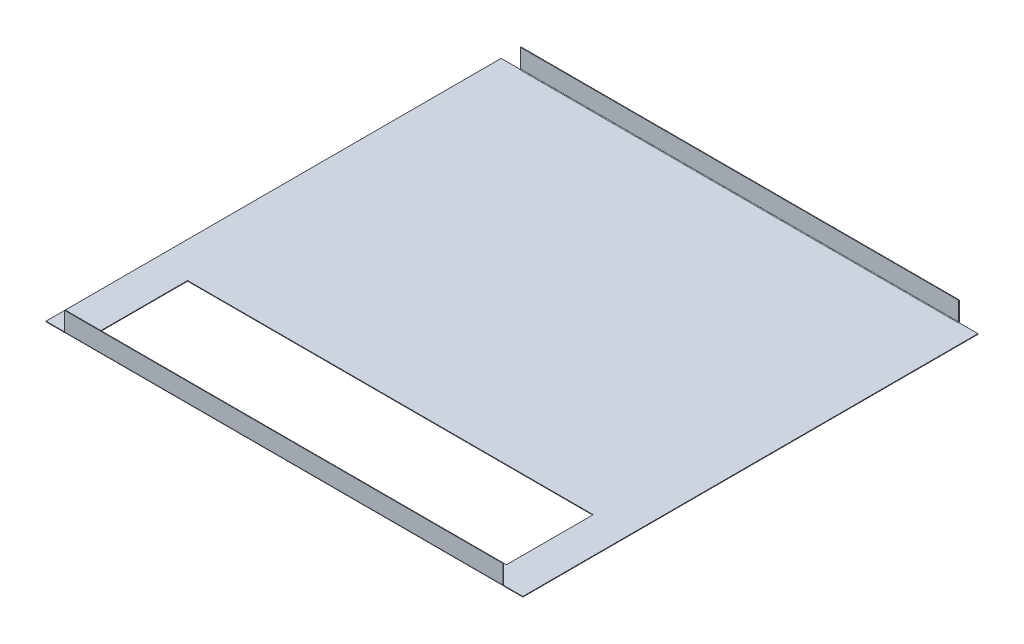
ISO-10303-21;
HEADER;
FILE_DESCRIPTION(('STEP AP214'),'2;1');
FILE_NAME('part.step','',(''),(''),'','','');
FILE_SCHEMA(('AUTOMOTIVE_DESIGN { 1 0 10303 214 1 1 1 1 }'));
ENDSEC;
DATA;
#1=APPLICATION_CONTEXT('core data for automotive mechanical design processes');
#2=APPLICATION_PROTOCOL_DEFINITION('international standard','automotive_design',2000,#1);
#3=PRODUCT_CONTEXT('',#1,'mechanical');
#4=PRODUCT('Part','Part','',(#3));
#5=PRODUCT_RELATED_PRODUCT_CATEGORY('part','',(#4));
#6=PRODUCT_DEFINITION_FORMATION('','',#4);
#7=PRODUCT_DEFINITION_CONTEXT('part definition',#1,'design');
#8=PRODUCT_DEFINITION('design','',#6,#7);
#9=PRODUCT_DEFINITION_SHAPE('','',#8);
#10=(LENGTH_UNIT() NAMED_UNIT(*) SI_UNIT(.MILLI.,.METRE.));
#11=(NAMED_UNIT(*) PLANE_ANGLE_UNIT() SI_UNIT($,.RADIAN.));
#12=(NAMED_UNIT(*) SI_UNIT($,.STERADIAN.) SOLID_ANGLE_UNIT());
#13=UNCERTAINTY_MEASURE_WITH_UNIT(LENGTH_MEASURE(1.E-05),#10,'distance_accuracy_value','');
#14=(GEOMETRIC_REPRESENTATION_CONTEXT(3) GLOBAL_UNCERTAINTY_ASSIGNED_CONTEXT((#13)) GLOBAL_UNIT_ASSIGNED_CONTEXT((#10,
#11,#12)) REPRESENTATION_CONTEXT('',''));
#15=CARTESIAN_POINT('',(0.,0.,0.));
#16=DIRECTION('',(0.,0.,1.));
#17=DIRECTION('',(1.,0.,0.));
#18=AXIS2_PLACEMENT_3D('',#15,#16,#17);
#19=CARTESIAN_POINT('',(-455.,0.,471.3));
#20=DIRECTION('',(1.,0.,0.));
#21=DIRECTION('',(0.,0.,-1.));
#22=AXIS2_PLACEMENT_3D('',#19,#20,#21);
#23=PLANE('',#22);
#24=DIRECTION('',(0.,0.,1.));
#25=VECTOR('',#24,1.);
#26=CARTESIAN_POINT('',(-455.000000000044,-1.2,-472.499999999956));
#27=LINE('',#26,#25);
#28=CARTESIAN_POINT('',(-455.,-1.2,471.3));
#29=VERTEX_POINT('',#28);
#30=CARTESIAN_POINT('',(-455.,-1.2,472.5));
#31=VERTEX_POINT('',#30);
#32=EDGE_CURVE('E275',#29,#31,#27,.T.);
#33=ORIENTED_EDGE('',*,*,#32,.F.);
#34=CARTESIAN_POINT('',(-455.,1.20000000000001,471.3));
#35=DIRECTION('',(1.,0.,0.));
#36=DIRECTION('',(0.,0.,-1.));
#37=AXIS2_PLACEMENT_3D('',#34,#35,#36);
#38=CIRCLE('',#37,2.40000000000003);
#39=CARTESIAN_POINT('',(-455.,-0.878460969082665,472.5));
#40=VERTEX_POINT('',#39);
#41=EDGE_CURVE('E52',#29,#40,#38,.F.);
#42=ORIENTED_EDGE('',*,*,#41,.T.);
#43=DIRECTION('',(0.,-1.,0.));
#44=VECTOR('',#43,1.);
#45=CARTESIAN_POINT('',(-455.,0.,472.5));
#46=LINE('',#45,#44);
#47=EDGE_CURVE('E279',#40,#31,#46,.T.);
#48=ORIENTED_EDGE('',*,*,#47,.T.);
#49=EDGE_LOOP('',(#33,#42,#48));
#50=FACE_BOUND('',#49,.T.);
#51=ADVANCED_FACE('F34',(#50),#23,.T.);
#52=CARTESIAN_POINT('',(455.,0.,472.5));
#53=DIRECTION('',(-1.,0.,0.));
#54=DIRECTION('',(0.,0.,1.));
#55=AXIS2_PLACEMENT_3D('',#52,#53,#54);
#56=PLANE('',#55);
#57=DIRECTION('',(0.,-1.,0.));
#58=VECTOR('',#57,1.);
#59=CARTESIAN_POINT('',(455.,0.,472.5));
#60=LINE('',#59,#58);
#61=CARTESIAN_POINT('',(455.,-0.878460969082665,472.5));
#62=VERTEX_POINT('',#61);
#63=CARTESIAN_POINT('',(455.,-1.2,472.5));
#64=VERTEX_POINT('',#63);
#65=EDGE_CURVE('E59',#62,#64,#60,.T.);
#66=ORIENTED_EDGE('',*,*,#65,.F.);
#67=CARTESIAN_POINT('',(455.,1.20000000000001,471.3));
#68=DIRECTION('',(1.,0.,0.));
#69=DIRECTION('',(0.,0.,-1.));
#70=AXIS2_PLACEMENT_3D('',#67,#68,#69);
#71=CIRCLE('',#70,2.40000000000003);
#72=CARTESIAN_POINT('',(455.,-1.2,471.3));
#73=VERTEX_POINT('',#72);
#74=EDGE_CURVE('E11',#62,#73,#71,.T.);
#75=ORIENTED_EDGE('',*,*,#74,.T.);
#76=DIRECTION('',(0.,0.,-1.));
#77=VECTOR('',#76,1.);
#78=CARTESIAN_POINT('',(455.000000000044,-1.2,-472.500000000002));
#79=LINE('',#78,#77);
#80=EDGE_CURVE('E286',#64,#73,#79,.T.);
#81=ORIENTED_EDGE('',*,*,#80,.F.);
#82=EDGE_LOOP('',(#66,#75,#81));
#83=FACE_BOUND('',#82,.T.);
#84=ADVANCED_FACE('F493',(#83),#56,.T.);
#85=CARTESIAN_POINT('',(495.,-1.2,-472.5));
#86=DIRECTION('',(0.,-1.,0.));
#87=DIRECTION('',(0.,0.,-1.));
#88=AXIS2_PLACEMENT_3D('',#85,#86,#87);
#89=PLANE('',#88);
#90=DIRECTION('',(0.,0.,-1.));
#91=VECTOR('',#90,1.);
#92=CARTESIAN_POINT('',(421.,-1.2,252.5));
#93=LINE('',#92,#91);
#94=CARTESIAN_POINT('',(421.,-1.2,432.5));
#95=VERTEX_POINT('',#94);
#96=CARTESIAN_POINT('',(421.,-1.2,252.5));
#97=VERTEX_POINT('',#96);
#98=EDGE_CURVE('E359',#95,#97,#93,.T.);
#99=ORIENTED_EDGE('',*,*,#98,.T.);
#100=DIRECTION('',(-1.,0.,0.));
#101=VECTOR('',#100,1.);
#102=CARTESIAN_POINT('',(-421.,-1.2,252.5));
#103=LINE('',#102,#101);
#104=CARTESIAN_POINT('',(-421.,-1.2,252.5));
#105=VERTEX_POINT('',#104);
#106=EDGE_CURVE('E362',#97,#105,#103,.T.);
#107=ORIENTED_EDGE('',*,*,#106,.T.);
#108=DIRECTION('',(0.,0.,1.));
#109=VECTOR('',#108,1.);
#110=CARTESIAN_POINT('',(-421.,-1.2,252.5));
#111=LINE('',#110,#109);
#112=CARTESIAN_POINT('',(-421.,-1.2,432.5));
#113=VERTEX_POINT('',#112);
#114=EDGE_CURVE('E366',#105,#113,#111,.T.);
#115=ORIENTED_EDGE('',*,*,#114,.T.);
#116=DIRECTION('',(1.,0.,0.));
#117=VECTOR('',#116,1.);
#118=CARTESIAN_POINT('',(-421.,-1.2,432.5));
#119=LINE('',#118,#117);
#120=EDGE_CURVE('E369',#113,#95,#119,.T.);
#121=ORIENTED_EDGE('',*,*,#120,.T.);
#122=EDGE_LOOP('',(#99,#107,#115,#121));
#123=FACE_BOUND('',#122,.T.);
#124=DIRECTION('',(1.,0.,0.));
#125=VECTOR('',#124,1.);
#126=CARTESIAN_POINT('',(-495.,-1.2,472.5));
#127=LINE('',#126,#125);
#128=CARTESIAN_POINT('',(495.,-1.2,472.5));
#129=VERTEX_POINT('',#128);
#130=EDGE_CURVE('E402',#64,#129,#127,.T.);
#131=ORIENTED_EDGE('',*,*,#130,.F.);
#132=ORIENTED_EDGE('',*,*,#80,.T.);
#133=DIRECTION('',(1.,0.,0.));
#134=VECTOR('',#133,1.);
#135=CARTESIAN_POINT('',(455.,-1.20000000000003,471.3));
#136=LINE('',#135,#134);
#137=EDGE_CURVE('E219',#73,#29,#136,.F.);
#138=ORIENTED_EDGE('',*,*,#137,.T.);
#139=ORIENTED_EDGE('',*,*,#32,.T.);
#140=CARTESIAN_POINT('',(-495.,-1.2,472.5));
#141=VERTEX_POINT('',#140);
#142=EDGE_CURVE('E403',#141,#31,#127,.T.);
#143=ORIENTED_EDGE('',*,*,#142,.F.);
#144=DIRECTION('',(0.,0.,1.));
#145=VECTOR('',#144,1.);
#146=CARTESIAN_POINT('',(-495.,-1.2,472.5));
#147=LINE('',#146,#145);
#148=CARTESIAN_POINT('',(-495.,-1.2,-472.5));
#149=VERTEX_POINT('',#148);
#150=EDGE_CURVE('E399',#149,#141,#147,.T.);
#151=ORIENTED_EDGE('',*,*,#150,.F.);
#152=DIRECTION('',(-1.,0.,0.));
#153=VECTOR('',#152,1.);
#154=CARTESIAN_POINT('',(-495.,-1.2,-472.5));
#155=LINE('',#154,#153);
#156=CARTESIAN_POINT('',(-455.,-1.2,-472.5));
#157=VERTEX_POINT('',#156);
#158=EDGE_CURVE('E394',#157,#149,#155,.T.);
#159=ORIENTED_EDGE('',*,*,#158,.F.);
#160=DIRECTION('',(0.,0.,1.));
#161=VECTOR('',#160,1.);
#162=CARTESIAN_POINT('',(-455.,-1.2,-472.500000000044));
#163=LINE('',#162,#161);
#164=CARTESIAN_POINT('',(-455.,-1.2,-471.3));
#165=VERTEX_POINT('',#164);
#166=EDGE_CURVE('E355',#157,#165,#163,.T.);
#167=ORIENTED_EDGE('',*,*,#166,.T.);
#168=DIRECTION('',(-1.,0.,0.));
#169=VECTOR('',#168,1.);
#170=CARTESIAN_POINT('',(-455.,-1.20000000000012,-471.3));
#171=LINE('',#170,#169);
#172=CARTESIAN_POINT('',(455.,-1.2,-471.3));
#173=VERTEX_POINT('',#172);
#174=EDGE_CURVE('E321',#165,#173,#171,.F.);
#175=ORIENTED_EDGE('',*,*,#174,.T.);
#176=DIRECTION('',(0.,0.,-1.));
#177=VECTOR('',#176,1.);
#178=CARTESIAN_POINT('',(455.,-1.2,-472.499999999998));
#179=LINE('',#178,#177);
#180=CARTESIAN_POINT('',(455.,-1.2,-472.5));
#181=VERTEX_POINT('',#180);
#182=EDGE_CURVE('E342',#173,#181,#179,.T.);
#183=ORIENTED_EDGE('',*,*,#182,.T.);
#184=CARTESIAN_POINT('',(495.,-1.2,-472.5));
#185=VERTEX_POINT('',#184);
#186=EDGE_CURVE('E396',#185,#181,#155,.T.);
#187=ORIENTED_EDGE('',*,*,#186,.F.);
#188=DIRECTION('',(0.,0.,-1.));
#189=VECTOR('',#188,1.);
#190=CARTESIAN_POINT('',(495.,-1.2,472.5));
#191=LINE('',#190,#189);
#192=EDGE_CURVE('E391',#129,#185,#191,.T.);
#193=ORIENTED_EDGE('',*,*,#192,.F.);
#194=EDGE_LOOP('',(#131,#132,#138,#139,#143,#151,#159,#167,#175,#183,#187,#193));
#195=FACE_BOUND('',#194,.T.);
#196=ADVANCED_FACE('F443',(#123,#195),#89,.T.);
#197=CARTESIAN_POINT('',(495.,0.,-472.5));
#198=DIRECTION('',(0.,-1.,0.));
#199=DIRECTION('',(0.,0.,-1.));
#200=AXIS2_PLACEMENT_3D('',#197,#198,#199);
#201=PLANE('',#200);
#202=DIRECTION('',(-1.,0.,0.));
#203=VECTOR('',#202,1.);
#204=CARTESIAN_POINT('',(-421.,0.,252.5));
#205=LINE('',#204,#203);
#206=CARTESIAN_POINT('',(421.,0.,252.5));
#207=VERTEX_POINT('',#206);
#208=CARTESIAN_POINT('',(-421.,0.,252.5));
#209=VERTEX_POINT('',#208);
#210=EDGE_CURVE('E374',#207,#209,#205,.T.);
#211=ORIENTED_EDGE('',*,*,#210,.F.);
#212=DIRECTION('',(0.,0.,-1.));
#213=VECTOR('',#212,1.);
#214=CARTESIAN_POINT('',(421.,0.,252.5));
#215=LINE('',#214,#213);
#216=CARTESIAN_POINT('',(421.,0.,432.5));
#217=VERTEX_POINT('',#216);
#218=EDGE_CURVE('E358',#217,#207,#215,.T.);
#219=ORIENTED_EDGE('',*,*,#218,.F.);
#220=DIRECTION('',(1.,0.,0.));
#221=VECTOR('',#220,1.);
#222=CARTESIAN_POINT('',(-421.,0.,432.5));
#223=LINE('',#222,#221);
#224=CARTESIAN_POINT('',(-421.,0.,432.5));
#225=VERTEX_POINT('',#224);
#226=EDGE_CURVE('E363',#225,#217,#223,.T.);
#227=ORIENTED_EDGE('',*,*,#226,.F.);
#228=DIRECTION('',(0.,0.,1.));
#229=VECTOR('',#228,1.);
#230=CARTESIAN_POINT('',(-421.,0.,252.5));
#231=LINE('',#230,#229);
#232=EDGE_CURVE('E377',#209,#225,#231,.T.);
#233=ORIENTED_EDGE('',*,*,#232,.F.);
#234=EDGE_LOOP('',(#211,#219,#227,#233));
#235=FACE_BOUND('',#234,.T.);
#236=DIRECTION('',(0.,0.,-1.));
#237=VECTOR('',#236,1.);
#238=CARTESIAN_POINT('',(455.,0.,472.5));
#239=LINE('',#238,#237);
#240=CARTESIAN_POINT('',(455.,0.,472.5));
#241=VERTEX_POINT('',#240);
#242=CARTESIAN_POINT('',(455.,0.,471.3));
#243=VERTEX_POINT('',#242);
#244=EDGE_CURVE('E273',#241,#243,#239,.T.);
#245=ORIENTED_EDGE('',*,*,#244,.F.);
#246=DIRECTION('',(1.,0.,0.));
#247=VECTOR('',#246,1.);
#248=CARTESIAN_POINT('',(-495.,0.,472.5));
#249=LINE('',#248,#247);
#250=CARTESIAN_POINT('',(495.,0.,472.5));
#251=VERTEX_POINT('',#250);
#252=EDGE_CURVE('E414',#241,#251,#249,.T.);
#253=ORIENTED_EDGE('',*,*,#252,.T.);
#254=DIRECTION('',(0.,0.,-1.));
#255=VECTOR('',#254,1.);
#256=CARTESIAN_POINT('',(495.,0.,472.5));
#257=LINE('',#256,#255);
#258=CARTESIAN_POINT('',(495.,0.,-472.5));
#259=VERTEX_POINT('',#258);
#260=EDGE_CURVE('E384',#251,#259,#257,.T.);
#261=ORIENTED_EDGE('',*,*,#260,.T.);
#262=DIRECTION('',(-1.,0.,0.));
#263=VECTOR('',#262,1.);
#264=CARTESIAN_POINT('',(-495.,0.,-472.5));
#265=LINE('',#264,#263);
#266=CARTESIAN_POINT('',(455.,0.,-472.5));
#267=VERTEX_POINT('',#266);
#268=EDGE_CURVE('E409',#259,#267,#265,.T.);
#269=ORIENTED_EDGE('',*,*,#268,.T.);
#270=DIRECTION('',(0.,1.01606977505152E-13,-1.));
#271=VECTOR('',#270,1.);
#272=CARTESIAN_POINT('',(455.,-1.19479079407903E-13,-471.3));
#273=LINE('',#272,#271);
#274=CARTESIAN_POINT('',(455.,0.,-471.3));
#275=VERTEX_POINT('',#274);
#276=EDGE_CURVE('E328',#275,#267,#273,.T.);
#277=ORIENTED_EDGE('',*,*,#276,.F.);
#278=DIRECTION('',(-1.,0.,0.));
#279=VECTOR('',#278,1.);
#280=CARTESIAN_POINT('',(-455.,-1.19479079407903E-13,-471.3));
#281=LINE('',#280,#279);
#282=CARTESIAN_POINT('',(-455.,0.,-471.3));
#283=VERTEX_POINT('',#282);
#284=EDGE_CURVE('E334',#283,#275,#281,.F.);
#285=ORIENTED_EDGE('',*,*,#284,.F.);
#286=DIRECTION('',(0.,-1.48041501972831E-13,1.));
#287=VECTOR('',#286,1.);
#288=CARTESIAN_POINT('',(-455.,0.,-472.5));
#289=LINE('',#288,#287);
#290=CARTESIAN_POINT('',(-455.,0.,-472.5));
#291=VERTEX_POINT('',#290);
#292=EDGE_CURVE('E339',#291,#283,#289,.T.);
#293=ORIENTED_EDGE('',*,*,#292,.F.);
#294=CARTESIAN_POINT('',(-495.,0.,-472.5));
#295=VERTEX_POINT('',#294);
#296=EDGE_CURVE('E408',#291,#295,#265,.T.);
#297=ORIENTED_EDGE('',*,*,#296,.T.);
#298=DIRECTION('',(0.,0.,1.));
#299=VECTOR('',#298,1.);
#300=CARTESIAN_POINT('',(-495.,0.,472.5));
#301=LINE('',#300,#299);
#302=CARTESIAN_POINT('',(-495.,0.,472.5));
#303=VERTEX_POINT('',#302);
#304=EDGE_CURVE('E411',#295,#303,#301,.T.);
#305=ORIENTED_EDGE('',*,*,#304,.T.);
#306=CARTESIAN_POINT('',(-455.,0.,472.5));
#307=VERTEX_POINT('',#306);
#308=EDGE_CURVE('E395',#303,#307,#249,.T.);
#309=ORIENTED_EDGE('',*,*,#308,.T.);
#310=DIRECTION('',(0.,0.,1.));
#311=VECTOR('',#310,1.);
#312=CARTESIAN_POINT('',(-455.,0.,471.3));
#313=LINE('',#312,#311);
#314=CARTESIAN_POINT('',(-455.,0.,471.3));
#315=VERTEX_POINT('',#314);
#316=EDGE_CURVE('E265',#315,#307,#313,.T.);
#317=ORIENTED_EDGE('',*,*,#316,.F.);
#318=DIRECTION('',(1.,0.,0.));
#319=VECTOR('',#318,1.);
#320=CARTESIAN_POINT('',(455.,0.,471.3));
#321=LINE('',#320,#319);
#322=EDGE_CURVE('E269',#243,#315,#321,.F.);
#323=ORIENTED_EDGE('',*,*,#322,.F.);
#324=EDGE_LOOP('',(#245,#253,#261,#269,#277,#285,#293,#297,#305,#309,#317,#323));
#325=FACE_BOUND('',#324,.T.);
#326=ADVANCED_FACE('F437',(#235,#325),#201,.F.);
#327=CARTESIAN_POINT('',(-495.,-1.2,472.5));
#328=DIRECTION('',(0.,0.,1.));
#329=DIRECTION('',(1.,0.,0.));
#330=AXIS2_PLACEMENT_3D('',#327,#328,#329);
#331=PLANE('',#330);
#332=ORIENTED_EDGE('',*,*,#252,.F.);
#333=EDGE_CURVE('E276',#241,#62,#60,.T.);
#334=ORIENTED_EDGE('',*,*,#333,.T.);
#335=ORIENTED_EDGE('',*,*,#65,.T.);
#336=ORIENTED_EDGE('',*,*,#130,.T.);
#337=DIRECTION('',(0.,1.,0.));
#338=VECTOR('',#337,1.);
#339=CARTESIAN_POINT('',(495.,-1.2,472.5));
#340=LINE('',#339,#338);
#341=EDGE_CURVE('E417',#129,#251,#340,.T.);
#342=ORIENTED_EDGE('',*,*,#341,.T.);
#343=EDGE_LOOP('',(#332,#334,#335,#336,#342));
#344=FACE_BOUND('',#343,.T.);
#345=ADVANCED_FACE('F440',(#344),#331,.T.);
#346=ORIENTED_EDGE('',*,*,#142,.T.);
#347=ORIENTED_EDGE('',*,*,#47,.F.);
#348=EDGE_CURVE('E280',#307,#40,#46,.T.);
#349=ORIENTED_EDGE('',*,*,#348,.F.);
#350=ORIENTED_EDGE('',*,*,#308,.F.);
#351=DIRECTION('',(0.,1.,0.));
#352=VECTOR('',#351,1.);
#353=CARTESIAN_POINT('',(-495.,-1.2,472.5));
#354=LINE('',#353,#352);
#355=EDGE_CURVE('E420',#141,#303,#354,.T.);
#356=ORIENTED_EDGE('',*,*,#355,.F.);
#357=EDGE_LOOP('',(#346,#347,#349,#350,#356));
#358=FACE_BOUND('',#357,.T.);
#359=ADVANCED_FACE('F643',(#358),#331,.T.);
#360=CARTESIAN_POINT('',(-455.,0.,-472.5));
#361=DIRECTION('',(1.,0.,0.));
#362=DIRECTION('',(0.,0.,-1.));
#363=AXIS2_PLACEMENT_3D('',#360,#361,#362);
#364=PLANE('',#363);
#365=DIRECTION('',(0.,-1.,0.));
#366=VECTOR('',#365,1.);
#367=CARTESIAN_POINT('',(-455.,0.,-472.5));
#368=LINE('',#367,#366);
#369=CARTESIAN_POINT('',(-455.,-0.878460969082798,-472.5));
#370=VERTEX_POINT('',#369);
#371=EDGE_CURVE('E350',#370,#157,#368,.T.);
#372=ORIENTED_EDGE('',*,*,#371,.F.);
#373=CARTESIAN_POINT('',(-455.,1.19999999999997,-471.3));
#374=DIRECTION('',(-1.,0.,0.));
#375=DIRECTION('',(0.,0.,1.));
#376=AXIS2_PLACEMENT_3D('',#373,#374,#375);
#377=CIRCLE('',#376,2.40000000000009);
#378=EDGE_CURVE('E43',#370,#165,#377,.T.);
#379=ORIENTED_EDGE('',*,*,#378,.T.);
#380=ORIENTED_EDGE('',*,*,#166,.F.);
#381=EDGE_LOOP('',(#372,#379,#380));
#382=FACE_BOUND('',#381,.T.);
#383=ADVANCED_FACE('F651',(#382),#364,.T.);
#384=CARTESIAN_POINT('',(455.,-1.19479079407903E-13,-471.3));
#385=DIRECTION('',(-1.,0.,0.));
#386=DIRECTION('',(0.,0.,1.));
#387=AXIS2_PLACEMENT_3D('',#384,#385,#386);
#388=PLANE('',#387);
#389=ORIENTED_EDGE('',*,*,#182,.F.);
#390=CARTESIAN_POINT('',(455.,1.19999999999997,-471.3));
#391=DIRECTION('',(-1.,0.,0.));
#392=DIRECTION('',(0.,0.,1.));
#393=AXIS2_PLACEMENT_3D('',#390,#391,#392);
#394=CIRCLE('',#393,2.40000000000009);
#395=CARTESIAN_POINT('',(455.,-0.878460969082734,-472.5));
#396=VERTEX_POINT('',#395);
#397=EDGE_CURVE('E325',#173,#396,#394,.F.);
#398=ORIENTED_EDGE('',*,*,#397,.T.);
#399=DIRECTION('',(0.,-1.,0.));
#400=VECTOR('',#399,1.);
#401=CARTESIAN_POINT('',(455.,0.,-472.5));
#402=LINE('',#401,#400);
#403=EDGE_CURVE('E346',#396,#181,#402,.T.);
#404=ORIENTED_EDGE('',*,*,#403,.T.);
#405=EDGE_LOOP('',(#389,#398,#404));
#406=FACE_BOUND('',#405,.T.);
#407=ADVANCED_FACE('F447',(#406),#388,.T.);
#408=CARTESIAN_POINT('',(-495.,-1.2,-472.5));
#409=DIRECTION('',(0.,0.,-1.));
#410=DIRECTION('',(-1.,0.,0.));
#411=AXIS2_PLACEMENT_3D('',#408,#409,#410);
#412=PLANE('',#411);
#413=ORIENTED_EDGE('',*,*,#296,.F.);
#414=EDGE_CURVE('E343',#291,#370,#368,.T.);
#415=ORIENTED_EDGE('',*,*,#414,.T.);
#416=ORIENTED_EDGE('',*,*,#371,.T.);
#417=ORIENTED_EDGE('',*,*,#158,.T.);
#418=DIRECTION('',(0.,1.,0.));
#419=VECTOR('',#418,1.);
#420=CARTESIAN_POINT('',(-495.,-1.2,-472.5));
#421=LINE('',#420,#419);
#422=EDGE_CURVE('E421',#149,#295,#421,.T.);
#423=ORIENTED_EDGE('',*,*,#422,.T.);
#424=EDGE_LOOP('',(#413,#415,#416,#417,#423));
#425=FACE_BOUND('',#424,.T.);
#426=ADVANCED_FACE('F732',(#425),#412,.T.);
#427=ORIENTED_EDGE('',*,*,#186,.T.);
#428=ORIENTED_EDGE('',*,*,#403,.F.);
#429=EDGE_CURVE('E347',#267,#396,#402,.T.);
#430=ORIENTED_EDGE('',*,*,#429,.F.);
#431=ORIENTED_EDGE('',*,*,#268,.F.);
#432=DIRECTION('',(0.,1.,0.));
#433=VECTOR('',#432,1.);
#434=CARTESIAN_POINT('',(495.,-1.2,-472.5));
#435=LINE('',#434,#433);
#436=EDGE_CURVE('E38',#185,#259,#435,.T.);
#437=ORIENTED_EDGE('',*,*,#436,.F.);
#438=EDGE_LOOP('',(#427,#428,#430,#431,#437));
#439=FACE_BOUND('',#438,.T.);
#440=ADVANCED_FACE('F435',(#439),#412,.T.);
#441=CARTESIAN_POINT('',(495.,-1.2,472.5));
#442=DIRECTION('',(1.,0.,0.));
#443=DIRECTION('',(0.,0.,-1.));
#444=AXIS2_PLACEMENT_3D('',#441,#442,#443);
#445=PLANE('',#444);
#446=ORIENTED_EDGE('',*,*,#260,.F.);
#447=ORIENTED_EDGE('',*,*,#341,.F.);
#448=ORIENTED_EDGE('',*,*,#192,.T.);
#449=ORIENTED_EDGE('',*,*,#436,.T.);
#450=EDGE_LOOP('',(#446,#447,#448,#449));
#451=FACE_BOUND('',#450,.T.);
#452=ADVANCED_FACE('F36',(#451),#445,.T.);
#453=CARTESIAN_POINT('',(-495.,-1.2,472.5));
#454=DIRECTION('',(-1.,0.,0.));
#455=DIRECTION('',(0.,0.,1.));
#456=AXIS2_PLACEMENT_3D('',#453,#454,#455);
#457=PLANE('',#456);
#458=ORIENTED_EDGE('',*,*,#304,.F.);
#459=ORIENTED_EDGE('',*,*,#422,.F.);
#460=ORIENTED_EDGE('',*,*,#150,.T.);
#461=ORIENTED_EDGE('',*,*,#355,.T.);
#462=EDGE_LOOP('',(#458,#459,#460,#461));
#463=FACE_BOUND('',#462,.T.);
#464=ADVANCED_FACE('F797',(#463),#457,.T.);
#465=CARTESIAN_POINT('',(421.,-1.2,252.5));
#466=DIRECTION('',(1.,0.,0.));
#467=DIRECTION('',(0.,0.,-1.));
#468=AXIS2_PLACEMENT_3D('',#465,#466,#467);
#469=PLANE('',#468);
#470=ORIENTED_EDGE('',*,*,#218,.T.);
#471=DIRECTION('',(0.,1.,0.));
#472=VECTOR('',#471,1.);
#473=CARTESIAN_POINT('',(421.,-1.2,252.5));
#474=LINE('',#473,#472);
#475=EDGE_CURVE('E372',#97,#207,#474,.T.);
#476=ORIENTED_EDGE('',*,*,#475,.F.);
#477=ORIENTED_EDGE('',*,*,#98,.F.);
#478=DIRECTION('',(0.,1.,0.));
#479=VECTOR('',#478,1.);
#480=CARTESIAN_POINT('',(421.,-1.2,432.5));
#481=LINE('',#480,#479);
#482=EDGE_CURVE('E382',#95,#217,#481,.T.);
#483=ORIENTED_EDGE('',*,*,#482,.T.);
#484=EDGE_LOOP('',(#470,#476,#477,#483));
#485=FACE_BOUND('',#484,.T.);
#486=ADVANCED_FACE('F786',(#485),#469,.F.);
#487=CARTESIAN_POINT('',(-421.,-1.2,432.5));
#488=DIRECTION('',(0.,0.,1.));
#489=DIRECTION('',(1.,0.,0.));
#490=AXIS2_PLACEMENT_3D('',#487,#488,#489);
#491=PLANE('',#490);
#492=ORIENTED_EDGE('',*,*,#226,.T.);
#493=ORIENTED_EDGE('',*,*,#482,.F.);
#494=ORIENTED_EDGE('',*,*,#120,.F.);
#495=DIRECTION('',(0.,1.,0.));
#496=VECTOR('',#495,1.);
#497=CARTESIAN_POINT('',(-421.,-1.2,432.5));
#498=LINE('',#497,#496);
#499=EDGE_CURVE('E385',#113,#225,#498,.T.);
#500=ORIENTED_EDGE('',*,*,#499,.T.);
#501=EDGE_LOOP('',(#492,#493,#494,#500));
#502=FACE_BOUND('',#501,.T.);
#503=ADVANCED_FACE('F775',(#502),#491,.F.);
#504=CARTESIAN_POINT('',(-421.,-1.2,252.5));
#505=DIRECTION('',(-1.,0.,0.));
#506=DIRECTION('',(0.,0.,1.));
#507=AXIS2_PLACEMENT_3D('',#504,#505,#506);
#508=PLANE('',#507);
#509=ORIENTED_EDGE('',*,*,#232,.T.);
#510=ORIENTED_EDGE('',*,*,#499,.F.);
#511=ORIENTED_EDGE('',*,*,#114,.F.);
#512=DIRECTION('',(0.,1.,0.));
#513=VECTOR('',#512,1.);
#514=CARTESIAN_POINT('',(-421.,-1.2,252.5));
#515=LINE('',#514,#513);
#516=EDGE_CURVE('E387',#105,#209,#515,.T.);
#517=ORIENTED_EDGE('',*,*,#516,.T.);
#518=EDGE_LOOP('',(#509,#510,#511,#517));
#519=FACE_BOUND('',#518,.T.);
#520=ADVANCED_FACE('F764',(#519),#508,.F.);
#521=CARTESIAN_POINT('',(-421.,-1.2,252.5));
#522=DIRECTION('',(0.,0.,-1.));
#523=DIRECTION('',(-1.,0.,0.));
#524=AXIS2_PLACEMENT_3D('',#521,#522,#523);
#525=PLANE('',#524);
#526=ORIENTED_EDGE('',*,*,#210,.T.);
#527=ORIENTED_EDGE('',*,*,#516,.F.);
#528=ORIENTED_EDGE('',*,*,#106,.F.);
#529=ORIENTED_EDGE('',*,*,#475,.T.);
#530=EDGE_LOOP('',(#526,#527,#528,#529));
#531=FACE_BOUND('',#530,.T.);
#532=ADVANCED_FACE('F720',(#531),#525,.F.);
#533=CARTESIAN_POINT('',(-455.,1.19999999999997,-471.3));
#534=DIRECTION('',(1.,0.,0.));
#535=DIRECTION('',(0.,0.,-1.));
#536=AXIS2_PLACEMENT_3D('',#533,#534,#535);
#537=PLANE('',#536);
#538=ORIENTED_EDGE('',*,*,#414,.F.);
#539=ORIENTED_EDGE('',*,*,#292,.T.);
#540=CARTESIAN_POINT('',(-455.,1.19999999999997,-471.3));
#541=DIRECTION('',(-1.,0.,0.));
#542=DIRECTION('',(0.,0.,1.));
#543=AXIS2_PLACEMENT_3D('',#540,#541,#542);
#544=CIRCLE('',#543,1.20000000000009);
#545=CARTESIAN_POINT('',(-455.,1.19999999999997,-472.5));
#546=VERTEX_POINT('',#545);
#547=EDGE_CURVE('E320',#546,#283,#544,.T.);
#548=ORIENTED_EDGE('',*,*,#547,.F.);
#549=DIRECTION('',(0.,0.,-1.));
#550=VECTOR('',#549,1.);
#551=CARTESIAN_POINT('',(-455.,1.19999999999998,-472.5));
#552=LINE('',#551,#550);
#553=CARTESIAN_POINT('',(-455.,1.19999999999999,-473.7));
#554=VERTEX_POINT('',#553);
#555=EDGE_CURVE('E292',#546,#554,#552,.T.);
#556=ORIENTED_EDGE('',*,*,#555,.T.);
#557=EDGE_CURVE('E324',#554,#370,#377,.T.);
#558=ORIENTED_EDGE('',*,*,#557,.T.);
#559=EDGE_LOOP('',(#538,#539,#548,#556,#558));
#560=FACE_BOUND('',#559,.T.);
#561=ADVANCED_FACE('F480',(#560),#537,.F.);
#562=CARTESIAN_POINT('',(455.,1.19999999999997,-471.3));
#563=DIRECTION('',(1.,0.,0.));
#564=DIRECTION('',(0.,0.,-1.));
#565=AXIS2_PLACEMENT_3D('',#562,#563,#564);
#566=PLANE('',#565);
#567=CARTESIAN_POINT('',(455.,1.19999999999997,-471.3));
#568=DIRECTION('',(-1.,0.,0.));
#569=DIRECTION('',(0.,0.,1.));
#570=AXIS2_PLACEMENT_3D('',#567,#568,#569);
#571=CIRCLE('',#570,1.20000000000009);
#572=CARTESIAN_POINT('',(455.,1.19999999999997,-472.5));
#573=VERTEX_POINT('',#572);
#574=EDGE_CURVE('E331',#275,#573,#571,.F.);
#575=ORIENTED_EDGE('',*,*,#574,.F.);
#576=ORIENTED_EDGE('',*,*,#276,.T.);
#577=ORIENTED_EDGE('',*,*,#429,.T.);
#578=CARTESIAN_POINT('',(455.,1.19999999999996,-473.7));
#579=VERTEX_POINT('',#578);
#580=EDGE_CURVE('E323',#396,#579,#394,.F.);
#581=ORIENTED_EDGE('',*,*,#580,.T.);
#582=DIRECTION('',(0.,0.,-1.));
#583=VECTOR('',#582,1.);
#584=CARTESIAN_POINT('',(455.,1.19999999999998,-472.5));
#585=LINE('',#584,#583);
#586=EDGE_CURVE('E289',#573,#579,#585,.T.);
#587=ORIENTED_EDGE('',*,*,#586,.F.);
#588=EDGE_LOOP('',(#575,#576,#577,#581,#587));
#589=FACE_BOUND('',#588,.T.);
#590=ADVANCED_FACE('F453',(#589),#566,.T.);
#591=CARTESIAN_POINT('',(-455.,1.19999999999997,-471.3));
#592=DIRECTION('',(-1.,0.,0.));
#593=DIRECTION('',(0.,0.,-1.));
#594=AXIS2_PLACEMENT_3D('',#591,#592,#593);
#595=CYLINDRICAL_SURFACE('',#594,2.40000000000009);
#596=ORIENTED_EDGE('',*,*,#174,.F.);
#597=ORIENTED_EDGE('',*,*,#378,.F.);
#598=ORIENTED_EDGE('',*,*,#557,.F.);
#599=DIRECTION('',(1.,0.,0.));
#600=VECTOR('',#599,1.);
#601=CARTESIAN_POINT('',(455.,1.19999999999999,-473.7));
#602=LINE('',#601,#600);
#603=EDGE_CURVE('E295',#554,#579,#602,.T.);
#604=ORIENTED_EDGE('',*,*,#603,.T.);
#605=ORIENTED_EDGE('',*,*,#580,.F.);
#606=ORIENTED_EDGE('',*,*,#397,.F.);
#607=EDGE_LOOP('',(#596,#597,#598,#604,#605,#606));
#608=FACE_BOUND('',#607,.T.);
#609=ADVANCED_FACE('F454',(#608),#595,.T.);
#610=CARTESIAN_POINT('',(-455.,1.19999999999997,-471.3));
#611=DIRECTION('',(-1.,0.,0.));
#612=DIRECTION('',(0.,0.,-1.));
#613=AXIS2_PLACEMENT_3D('',#610,#611,#612);
#614=CYLINDRICAL_SURFACE('',#613,1.20000000000009);
#615=ORIENTED_EDGE('',*,*,#284,.T.);
#616=ORIENTED_EDGE('',*,*,#574,.T.);
#617=DIRECTION('',(-1.,0.,0.));
#618=VECTOR('',#617,1.);
#619=CARTESIAN_POINT('',(455.,1.19999999999998,-472.5));
#620=LINE('',#619,#618);
#621=EDGE_CURVE('E290',#573,#546,#620,.T.);
#622=ORIENTED_EDGE('',*,*,#621,.T.);
#623=ORIENTED_EDGE('',*,*,#547,.T.);
#624=EDGE_LOOP('',(#615,#616,#622,#623));
#625=FACE_BOUND('',#624,.T.);
#626=ADVANCED_FACE('F476',(#625),#614,.F.);
#627=CARTESIAN_POINT('',(455.,0.,-473.7));
#628=DIRECTION('',(-1.,0.,0.));
#629=DIRECTION('',(0.,0.,1.));
#630=AXIS2_PLACEMENT_3D('',#627,#628,#629);
#631=PLANE('',#630);
#632=ORIENTED_EDGE('',*,*,#586,.T.);
#633=DIRECTION('',(0.,-1.,0.));
#634=VECTOR('',#633,1.);
#635=CARTESIAN_POINT('',(455.,0.,-473.7));
#636=LINE('',#635,#634);
#637=CARTESIAN_POINT('',(455.,40.,-473.7));
#638=VERTEX_POINT('',#637);
#639=EDGE_CURVE('E301',#638,#579,#636,.T.);
#640=ORIENTED_EDGE('',*,*,#639,.F.);
#641=DIRECTION('',(0.,0.,1.));
#642=VECTOR('',#641,1.);
#643=CARTESIAN_POINT('',(455.,40.,-473.7));
#644=LINE('',#643,#642);
#645=CARTESIAN_POINT('',(455.,40.,-472.5));
#646=VERTEX_POINT('',#645);
#647=EDGE_CURVE('E309',#638,#646,#644,.T.);
#648=ORIENTED_EDGE('',*,*,#647,.T.);
#649=DIRECTION('',(0.,-1.,0.));
#650=VECTOR('',#649,1.);
#651=CARTESIAN_POINT('',(455.,0.,-472.5));
#652=LINE('',#651,#650);
#653=EDGE_CURVE('E300',#646,#573,#652,.T.);
#654=ORIENTED_EDGE('',*,*,#653,.T.);
#655=EDGE_LOOP('',(#632,#640,#648,#654));
#656=FACE_BOUND('',#655,.T.);
#657=ADVANCED_FACE('F461',(#656),#631,.F.);
#658=CARTESIAN_POINT('',(-455.,40.,-473.7));
#659=DIRECTION('',(1.,0.,0.));
#660=DIRECTION('',(0.,0.,-1.));
#661=AXIS2_PLACEMENT_3D('',#658,#659,#660);
#662=PLANE('',#661);
#663=ORIENTED_EDGE('',*,*,#555,.F.);
#664=DIRECTION('',(0.,1.,0.));
#665=VECTOR('',#664,1.);
#666=CARTESIAN_POINT('',(-455.,40.,-472.5));
#667=LINE('',#666,#665);
#668=CARTESIAN_POINT('',(-455.,40.,-472.5));
#669=VERTEX_POINT('',#668);
#670=EDGE_CURVE('E312',#546,#669,#667,.T.);
#671=ORIENTED_EDGE('',*,*,#670,.T.);
#672=DIRECTION('',(0.,0.,1.));
#673=VECTOR('',#672,1.);
#674=CARTESIAN_POINT('',(-455.,40.,-473.7));
#675=LINE('',#674,#673);
#676=CARTESIAN_POINT('',(-455.,40.,-473.7));
#677=VERTEX_POINT('',#676);
#678=EDGE_CURVE('E317',#677,#669,#675,.T.);
#679=ORIENTED_EDGE('',*,*,#678,.F.);
#680=DIRECTION('',(0.,1.,0.));
#681=VECTOR('',#680,1.);
#682=CARTESIAN_POINT('',(-455.,40.,-473.7));
#683=LINE('',#682,#681);
#684=EDGE_CURVE('E304',#554,#677,#683,.T.);
#685=ORIENTED_EDGE('',*,*,#684,.F.);
#686=EDGE_LOOP('',(#663,#671,#679,#685));
#687=FACE_BOUND('',#686,.T.);
#688=ADVANCED_FACE('F482',(#687),#662,.F.);
#689=CARTESIAN_POINT('',(455.,40.,-473.7));
#690=DIRECTION('',(0.,0.,1.));
#691=DIRECTION('',(0.,-1.,0.));
#692=AXIS2_PLACEMENT_3D('',#689,#690,#691);
#693=PLANE('',#692);
#694=ORIENTED_EDGE('',*,*,#603,.F.);
#695=ORIENTED_EDGE('',*,*,#684,.T.);
#696=DIRECTION('',(1.,0.,0.));
#697=VECTOR('',#696,1.);
#698=CARTESIAN_POINT('',(455.,40.,-473.7));
#699=LINE('',#698,#697);
#700=EDGE_CURVE('E307',#677,#638,#699,.T.);
#701=ORIENTED_EDGE('',*,*,#700,.T.);
#702=ORIENTED_EDGE('',*,*,#639,.T.);
#703=EDGE_LOOP('',(#694,#695,#701,#702));
#704=FACE_BOUND('',#703,.T.);
#705=ADVANCED_FACE('F463',(#704),#693,.F.);
#706=CARTESIAN_POINT('',(455.,40.,-472.5));
#707=DIRECTION('',(0.,0.,1.));
#708=DIRECTION('',(0.,-1.,0.));
#709=AXIS2_PLACEMENT_3D('',#706,#707,#708);
#710=PLANE('',#709);
#711=ORIENTED_EDGE('',*,*,#670,.F.);
#712=ORIENTED_EDGE('',*,*,#621,.F.);
#713=ORIENTED_EDGE('',*,*,#653,.F.);
#714=DIRECTION('',(1.,0.,0.));
#715=VECTOR('',#714,1.);
#716=CARTESIAN_POINT('',(455.,40.,-472.5));
#717=LINE('',#716,#715);
#718=EDGE_CURVE('E305',#669,#646,#717,.T.);
#719=ORIENTED_EDGE('',*,*,#718,.F.);
#720=EDGE_LOOP('',(#711,#712,#713,#719));
#721=FACE_BOUND('',#720,.T.);
#722=ADVANCED_FACE('F473',(#721),#710,.T.);
#723=CARTESIAN_POINT('',(455.,40.,-473.7));
#724=DIRECTION('',(0.,-1.,0.));
#725=DIRECTION('',(0.,0.,-1.));
#726=AXIS2_PLACEMENT_3D('',#723,#724,#725);
#727=PLANE('',#726);
#728=ORIENTED_EDGE('',*,*,#718,.T.);
#729=ORIENTED_EDGE('',*,*,#647,.F.);
#730=ORIENTED_EDGE('',*,*,#700,.F.);
#731=ORIENTED_EDGE('',*,*,#678,.T.);
#732=EDGE_LOOP('',(#728,#729,#730,#731));
#733=FACE_BOUND('',#732,.T.);
#734=ADVANCED_FACE('F468',(#733),#727,.F.);
#735=CARTESIAN_POINT('',(455.,1.20000000000001,471.3));
#736=DIRECTION('',(-1.,0.,0.));
#737=DIRECTION('',(0.,0.,1.));
#738=AXIS2_PLACEMENT_3D('',#735,#736,#737);
#739=PLANE('',#738);
#740=ORIENTED_EDGE('',*,*,#333,.F.);
#741=ORIENTED_EDGE('',*,*,#244,.T.);
#742=CARTESIAN_POINT('',(455.,1.20000000000001,471.3));
#743=DIRECTION('',(1.,0.,0.));
#744=DIRECTION('',(0.,0.,-1.));
#745=AXIS2_PLACEMENT_3D('',#742,#743,#744);
#746=CIRCLE('',#745,1.20000000000003);
#747=CARTESIAN_POINT('',(455.,1.20000000000001,472.5));
#748=VERTEX_POINT('',#747);
#749=EDGE_CURVE('E227',#748,#243,#746,.T.);
#750=ORIENTED_EDGE('',*,*,#749,.F.);
#751=DIRECTION('',(0.,0.,1.));
#752=VECTOR('',#751,1.);
#753=CARTESIAN_POINT('',(455.,1.20000000000003,472.5));
#754=LINE('',#753,#752);
#755=CARTESIAN_POINT('',(455.,1.20000000000003,473.7));
#756=VERTEX_POINT('',#755);
#757=EDGE_CURVE('E223',#748,#756,#754,.T.);
#758=ORIENTED_EDGE('',*,*,#757,.T.);
#759=EDGE_CURVE('E45',#756,#62,#71,.T.);
#760=ORIENTED_EDGE('',*,*,#759,.T.);
#761=EDGE_LOOP('',(#740,#741,#750,#758,#760));
#762=FACE_BOUND('',#761,.T.);
#763=ADVANCED_FACE('F224',(#762),#739,.F.);
#764=CARTESIAN_POINT('',(-455.,1.20000000000001,471.3));
#765=DIRECTION('',(-1.,0.,0.));
#766=DIRECTION('',(0.,0.,1.));
#767=AXIS2_PLACEMENT_3D('',#764,#765,#766);
#768=PLANE('',#767);
#769=CARTESIAN_POINT('',(-455.,1.20000000000001,471.3));
#770=DIRECTION('',(1.,0.,0.));
#771=DIRECTION('',(0.,0.,-1.));
#772=AXIS2_PLACEMENT_3D('',#769,#770,#771);
#773=CIRCLE('',#772,1.20000000000003);
#774=CARTESIAN_POINT('',(-455.,1.20000000000001,472.5));
#775=VERTEX_POINT('',#774);
#776=EDGE_CURVE('E220',#315,#775,#773,.F.);
#777=ORIENTED_EDGE('',*,*,#776,.F.);
#778=ORIENTED_EDGE('',*,*,#316,.T.);
#779=ORIENTED_EDGE('',*,*,#348,.T.);
#780=CARTESIAN_POINT('',(-455.,1.20000000000001,473.7));
#781=VERTEX_POINT('',#780);
#782=EDGE_CURVE('E264',#40,#781,#38,.F.);
#783=ORIENTED_EDGE('',*,*,#782,.T.);
#784=DIRECTION('',(0.,0.,1.));
#785=VECTOR('',#784,1.);
#786=CARTESIAN_POINT('',(-455.,1.19999999999998,472.5));
#787=LINE('',#786,#785);
#788=EDGE_CURVE('E850',#775,#781,#787,.T.);
#789=ORIENTED_EDGE('',*,*,#788,.F.);
#790=EDGE_LOOP('',(#777,#778,#779,#783,#789));
#791=FACE_BOUND('',#790,.T.);
#792=ADVANCED_FACE('F507',(#791),#768,.T.);
#793=CARTESIAN_POINT('',(455.,1.20000000000001,471.3));
#794=DIRECTION('',(1.,0.,0.));
#795=DIRECTION('',(0.,0.,1.));
#796=AXIS2_PLACEMENT_3D('',#793,#794,#795);
#797=CYLINDRICAL_SURFACE('',#796,2.40000000000003);
#798=ORIENTED_EDGE('',*,*,#137,.F.);
#799=ORIENTED_EDGE('',*,*,#74,.F.);
#800=ORIENTED_EDGE('',*,*,#759,.F.);
#801=DIRECTION('',(-1.,0.,0.));
#802=VECTOR('',#801,1.);
#803=CARTESIAN_POINT('',(455.,1.20000000000003,473.7));
#804=LINE('',#803,#802);
#805=EDGE_CURVE('E215',#756,#781,#804,.T.);
#806=ORIENTED_EDGE('',*,*,#805,.T.);
#807=ORIENTED_EDGE('',*,*,#782,.F.);
#808=ORIENTED_EDGE('',*,*,#41,.F.);
#809=EDGE_LOOP('',(#798,#799,#800,#806,#807,#808));
#810=FACE_BOUND('',#809,.T.);
#811=ADVANCED_FACE('F212',(#810),#797,.T.);
#812=CARTESIAN_POINT('',(455.,1.20000000000001,471.3));
#813=DIRECTION('',(1.,0.,0.));
#814=DIRECTION('',(0.,0.,1.));
#815=AXIS2_PLACEMENT_3D('',#812,#813,#814);
#816=CYLINDRICAL_SURFACE('',#815,1.20000000000003);
#817=ORIENTED_EDGE('',*,*,#322,.T.);
#818=ORIENTED_EDGE('',*,*,#776,.T.);
#819=DIRECTION('',(1.,0.,0.));
#820=VECTOR('',#819,1.);
#821=CARTESIAN_POINT('',(-455.,1.19999999999998,472.5));
#822=LINE('',#821,#820);
#823=EDGE_CURVE('E231',#775,#748,#822,.T.);
#824=ORIENTED_EDGE('',*,*,#823,.T.);
#825=ORIENTED_EDGE('',*,*,#749,.T.);
#826=EDGE_LOOP('',(#817,#818,#824,#825));
#827=FACE_BOUND('',#826,.T.);
#828=ADVANCED_FACE('F515',(#827),#816,.F.);
#829=CARTESIAN_POINT('',(455.,40.,473.7));
#830=DIRECTION('',(-1.,0.,0.));
#831=DIRECTION('',(0.,0.,1.));
#832=AXIS2_PLACEMENT_3D('',#829,#830,#831);
#833=PLANE('',#832);
#834=ORIENTED_EDGE('',*,*,#757,.F.);
#835=DIRECTION('',(0.,1.,0.));
#836=VECTOR('',#835,1.);
#837=CARTESIAN_POINT('',(455.,40.,472.5));
#838=LINE('',#837,#836);
#839=CARTESIAN_POINT('',(455.,40.,472.5));
#840=VERTEX_POINT('',#839);
#841=EDGE_CURVE('E240',#748,#840,#838,.T.);
#842=ORIENTED_EDGE('',*,*,#841,.T.);
#843=DIRECTION('',(0.,0.,-1.));
#844=VECTOR('',#843,1.);
#845=CARTESIAN_POINT('',(455.,40.,473.7));
#846=LINE('',#845,#844);
#847=CARTESIAN_POINT('',(455.,40.,473.7));
#848=VERTEX_POINT('',#847);
#849=EDGE_CURVE('E244',#848,#840,#846,.T.);
#850=ORIENTED_EDGE('',*,*,#849,.F.);
#851=DIRECTION('',(0.,1.,0.));
#852=VECTOR('',#851,1.);
#853=CARTESIAN_POINT('',(455.,40.,473.7));
#854=LINE('',#853,#852);
#855=EDGE_CURVE('E236',#756,#848,#854,.T.);
#856=ORIENTED_EDGE('',*,*,#855,.F.);
#857=EDGE_LOOP('',(#834,#842,#850,#856));
#858=FACE_BOUND('',#857,.T.);
#859=ADVANCED_FACE('F242',(#858),#833,.F.);
#860=CARTESIAN_POINT('',(-455.,0.,473.7));
#861=DIRECTION('',(1.,0.,0.));
#862=DIRECTION('',(0.,0.,-1.));
#863=AXIS2_PLACEMENT_3D('',#860,#861,#862);
#864=PLANE('',#863);
#865=ORIENTED_EDGE('',*,*,#788,.T.);
#866=DIRECTION('',(0.,-1.,0.));
#867=VECTOR('',#866,1.);
#868=CARTESIAN_POINT('',(-455.,0.,473.7));
#869=LINE('',#868,#867);
#870=CARTESIAN_POINT('',(-455.,40.,473.7));
#871=VERTEX_POINT('',#870);
#872=EDGE_CURVE('E239',#871,#781,#869,.T.);
#873=ORIENTED_EDGE('',*,*,#872,.F.);
#874=DIRECTION('',(0.,0.,-1.));
#875=VECTOR('',#874,1.);
#876=CARTESIAN_POINT('',(-455.,40.,473.7));
#877=LINE('',#876,#875);
#878=CARTESIAN_POINT('',(-455.,40.,472.5));
#879=VERTEX_POINT('',#878);
#880=EDGE_CURVE('E256',#871,#879,#877,.T.);
#881=ORIENTED_EDGE('',*,*,#880,.T.);
#882=DIRECTION('',(0.,-1.,0.));
#883=VECTOR('',#882,1.);
#884=CARTESIAN_POINT('',(-455.,0.,472.5));
#885=LINE('',#884,#883);
#886=EDGE_CURVE('E247',#879,#775,#885,.T.);
#887=ORIENTED_EDGE('',*,*,#886,.T.);
#888=EDGE_LOOP('',(#865,#873,#881,#887));
#889=FACE_BOUND('',#888,.T.);
#890=ADVANCED_FACE('F524',(#889),#864,.F.);
#891=CARTESIAN_POINT('',(455.,0.,473.7));
#892=DIRECTION('',(0.,0.,-1.));
#893=DIRECTION('',(-1.,0.,0.));
#894=AXIS2_PLACEMENT_3D('',#891,#892,#893);
#895=PLANE('',#894);
#896=ORIENTED_EDGE('',*,*,#805,.F.);
#897=ORIENTED_EDGE('',*,*,#855,.T.);
#898=DIRECTION('',(-1.,0.,0.));
#899=VECTOR('',#898,1.);
#900=CARTESIAN_POINT('',(-455.,40.,473.7));
#901=LINE('',#900,#899);
#902=EDGE_CURVE('E246',#848,#871,#901,.T.);
#903=ORIENTED_EDGE('',*,*,#902,.T.);
#904=ORIENTED_EDGE('',*,*,#872,.T.);
#905=EDGE_LOOP('',(#896,#897,#903,#904));
#906=FACE_BOUND('',#905,.T.);
#907=ADVANCED_FACE('F235',(#906),#895,.F.);
#908=CARTESIAN_POINT('',(455.,0.,472.5));
#909=DIRECTION('',(0.,0.,-1.));
#910=DIRECTION('',(-1.,0.,0.));
#911=AXIS2_PLACEMENT_3D('',#908,#909,#910);
#912=PLANE('',#911);
#913=ORIENTED_EDGE('',*,*,#841,.F.);
#914=ORIENTED_EDGE('',*,*,#823,.F.);
#915=ORIENTED_EDGE('',*,*,#886,.F.);
#916=DIRECTION('',(-1.,0.,0.));
#917=VECTOR('',#916,1.);
#918=CARTESIAN_POINT('',(-455.,40.,472.5));
#919=LINE('',#918,#917);
#920=EDGE_CURVE('E251',#840,#879,#919,.T.);
#921=ORIENTED_EDGE('',*,*,#920,.F.);
#922=EDGE_LOOP('',(#913,#914,#915,#921));
#923=FACE_BOUND('',#922,.T.);
#924=ADVANCED_FACE('F528',(#923),#912,.T.);
#925=CARTESIAN_POINT('',(-455.,40.,473.7));
#926=DIRECTION('',(0.,-1.,0.));
#927=DIRECTION('',(0.,0.,-1.));
#928=AXIS2_PLACEMENT_3D('',#925,#926,#927);
#929=PLANE('',#928);
#930=ORIENTED_EDGE('',*,*,#920,.T.);
#931=ORIENTED_EDGE('',*,*,#880,.F.);
#932=ORIENTED_EDGE('',*,*,#902,.F.);
#933=ORIENTED_EDGE('',*,*,#849,.T.);
#934=EDGE_LOOP('',(#930,#931,#932,#933));
#935=FACE_BOUND('',#934,.T.);
#936=ADVANCED_FACE('F525',(#935),#929,.F.);
#937=CLOSED_SHELL('',(#51,#84,#196,#326,#345,#359,#383,#407,#426,#440,#452,#464,#486,#503,#520,
#532,#561,#590,#609,#626,#657,#688,#705,#722,#734,#763,#792,#811,#828,#859,#890,#907,#924,#936));
#938=MANIFOLD_SOLID_BREP('B2',#937);
#939=ADVANCED_BREP_SHAPE_REPRESENTATION('',(#18,#938),#14);
#940=SHAPE_DEFINITION_REPRESENTATION(#9,#939);
ENDSEC;
END-ISO-10303-21;
